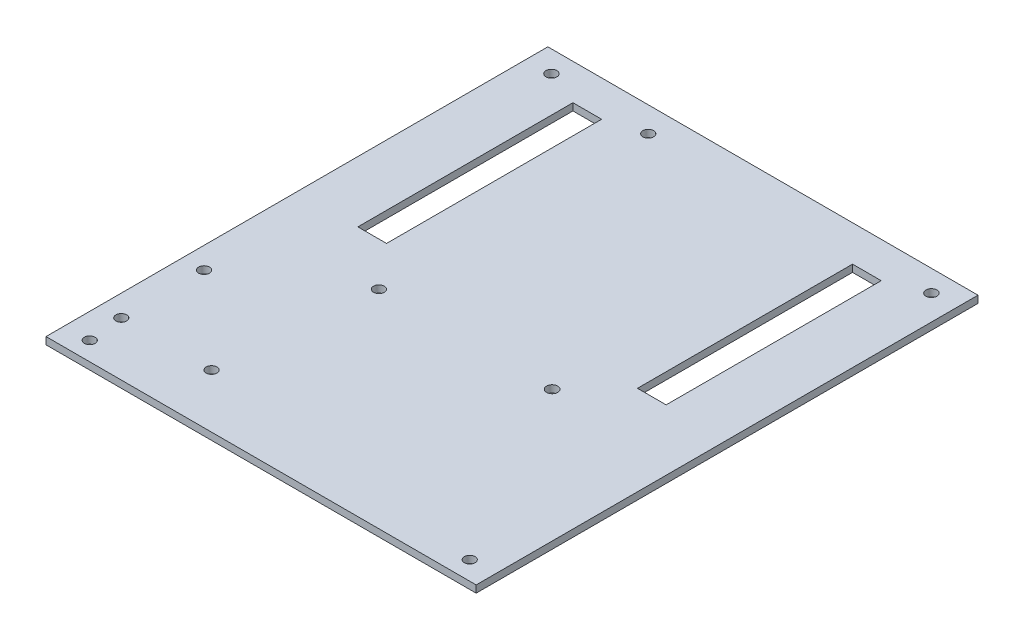
ISO-10303-21;
HEADER;
FILE_DESCRIPTION(('STEP AP214'),'2;1');
FILE_NAME('part.step','',(''),(''),'','','');
FILE_SCHEMA(('AUTOMOTIVE_DESIGN { 1 0 10303 214 1 1 1 1 }'));
ENDSEC;
DATA;
#1=APPLICATION_CONTEXT('core data for automotive mechanical design processes');
#2=APPLICATION_PROTOCOL_DEFINITION('international standard','automotive_design',2000,#1);
#3=PRODUCT_CONTEXT('',#1,'mechanical');
#4=PRODUCT('Part','Part','',(#3));
#5=PRODUCT_RELATED_PRODUCT_CATEGORY('part','',(#4));
#6=PRODUCT_DEFINITION_FORMATION('','',#4);
#7=PRODUCT_DEFINITION_CONTEXT('part definition',#1,'design');
#8=PRODUCT_DEFINITION('design','',#6,#7);
#9=PRODUCT_DEFINITION_SHAPE('','',#8);
#10=(LENGTH_UNIT() NAMED_UNIT(*) SI_UNIT(.MILLI.,.METRE.));
#11=(NAMED_UNIT(*) PLANE_ANGLE_UNIT() SI_UNIT($,.RADIAN.));
#12=(NAMED_UNIT(*) SI_UNIT($,.STERADIAN.) SOLID_ANGLE_UNIT());
#13=UNCERTAINTY_MEASURE_WITH_UNIT(LENGTH_MEASURE(1.E-05),#10,'distance_accuracy_value','');
#14=(GEOMETRIC_REPRESENTATION_CONTEXT(3) GLOBAL_UNCERTAINTY_ASSIGNED_CONTEXT((#13)) GLOBAL_UNIT_ASSIGNED_CONTEXT((#10,
#11,#12)) REPRESENTATION_CONTEXT('',''));
#15=CARTESIAN_POINT('',(0.,0.,0.));
#16=DIRECTION('',(0.,0.,1.));
#17=DIRECTION('',(1.,0.,0.));
#18=AXIS2_PLACEMENT_3D('',#15,#16,#17);
#19=CARTESIAN_POINT('',(-60.,2.,70.));
#20=DIRECTION('',(1.,0.,0.));
#21=DIRECTION('',(0.,0.,-1.));
#22=AXIS2_PLACEMENT_3D('',#19,#20,#21);
#23=PLANE('',#22);
#24=DIRECTION('',(0.,0.,1.));
#25=VECTOR('',#24,1.);
#26=CARTESIAN_POINT('',(-60.,0.,70.));
#27=LINE('',#26,#25);
#28=CARTESIAN_POINT('',(-60.,0.,-70.));
#29=VERTEX_POINT('',#28);
#30=CARTESIAN_POINT('',(-60.,0.,70.));
#31=VERTEX_POINT('',#30);
#32=EDGE_CURVE('E233',#29,#31,#27,.T.);
#33=ORIENTED_EDGE('',*,*,#32,.T.);
#34=DIRECTION('',(0.,-1.,0.));
#35=VECTOR('',#34,1.);
#36=CARTESIAN_POINT('',(-60.,2.,70.));
#37=LINE('',#36,#35);
#38=CARTESIAN_POINT('',(-60.,2.,70.));
#39=VERTEX_POINT('',#38);
#40=EDGE_CURVE('E11',#39,#31,#37,.T.);
#41=ORIENTED_EDGE('',*,*,#40,.F.);
#42=DIRECTION('',(0.,0.,1.));
#43=VECTOR('',#42,1.);
#44=CARTESIAN_POINT('',(-60.,2.,70.));
#45=LINE('',#44,#43);
#46=CARTESIAN_POINT('',(-60.,2.,-70.));
#47=VERTEX_POINT('',#46);
#48=EDGE_CURVE('E236',#47,#39,#45,.T.);
#49=ORIENTED_EDGE('',*,*,#48,.F.);
#50=DIRECTION('',(0.,-1.,0.));
#51=VECTOR('',#50,1.);
#52=CARTESIAN_POINT('',(-60.,2.,-70.));
#53=LINE('',#52,#51);
#54=EDGE_CURVE('E246',#47,#29,#53,.T.);
#55=ORIENTED_EDGE('',*,*,#54,.T.);
#56=EDGE_LOOP('',(#33,#41,#49,#55));
#57=FACE_BOUND('',#56,.T.);
#58=ADVANCED_FACE('F33',(#57),#23,.F.);
#59=CARTESIAN_POINT('',(60.,2.,70.));
#60=DIRECTION('',(0.,0.,-1.));
#61=DIRECTION('',(-1.,0.,0.));
#62=AXIS2_PLACEMENT_3D('',#59,#60,#61);
#63=PLANE('',#62);
#64=DIRECTION('',(1.,0.,0.));
#65=VECTOR('',#64,1.);
#66=CARTESIAN_POINT('',(60.,0.,70.));
#67=LINE('',#66,#65);
#68=CARTESIAN_POINT('',(60.,0.,70.));
#69=VERTEX_POINT('',#68);
#70=EDGE_CURVE('E249',#31,#69,#67,.T.);
#71=ORIENTED_EDGE('',*,*,#70,.T.);
#72=DIRECTION('',(0.,-1.,0.));
#73=VECTOR('',#72,1.);
#74=CARTESIAN_POINT('',(60.,2.,70.));
#75=LINE('',#74,#73);
#76=CARTESIAN_POINT('',(60.,2.,70.));
#77=VERTEX_POINT('',#76);
#78=EDGE_CURVE('E40',#77,#69,#75,.T.);
#79=ORIENTED_EDGE('',*,*,#78,.F.);
#80=DIRECTION('',(1.,0.,0.));
#81=VECTOR('',#80,1.);
#82=CARTESIAN_POINT('',(60.,2.,70.));
#83=LINE('',#82,#81);
#84=EDGE_CURVE('E239',#39,#77,#83,.T.);
#85=ORIENTED_EDGE('',*,*,#84,.F.);
#86=ORIENTED_EDGE('',*,*,#40,.T.);
#87=EDGE_LOOP('',(#71,#79,#85,#86));
#88=FACE_BOUND('',#87,.T.);
#89=ADVANCED_FACE('F278',(#88),#63,.F.);
#90=CARTESIAN_POINT('',(60.,2.,70.));
#91=DIRECTION('',(-1.,0.,0.));
#92=DIRECTION('',(0.,0.,1.));
#93=AXIS2_PLACEMENT_3D('',#90,#91,#92);
#94=PLANE('',#93);
#95=DIRECTION('',(0.,0.,-1.));
#96=VECTOR('',#95,1.);
#97=CARTESIAN_POINT('',(60.,0.,70.));
#98=LINE('',#97,#96);
#99=CARTESIAN_POINT('',(60.,0.,-70.));
#100=VERTEX_POINT('',#99);
#101=EDGE_CURVE('E251',#69,#100,#98,.T.);
#102=ORIENTED_EDGE('',*,*,#101,.T.);
#103=DIRECTION('',(0.,-1.,0.));
#104=VECTOR('',#103,1.);
#105=CARTESIAN_POINT('',(60.,2.,-70.));
#106=LINE('',#105,#104);
#107=CARTESIAN_POINT('',(60.,2.,-70.));
#108=VERTEX_POINT('',#107);
#109=EDGE_CURVE('E256',#108,#100,#106,.T.);
#110=ORIENTED_EDGE('',*,*,#109,.F.);
#111=DIRECTION('',(0.,0.,-1.));
#112=VECTOR('',#111,1.);
#113=CARTESIAN_POINT('',(60.,2.,70.));
#114=LINE('',#113,#112);
#115=EDGE_CURVE('E242',#77,#108,#114,.T.);
#116=ORIENTED_EDGE('',*,*,#115,.F.);
#117=ORIENTED_EDGE('',*,*,#78,.T.);
#118=EDGE_LOOP('',(#102,#110,#116,#117));
#119=FACE_BOUND('',#118,.T.);
#120=ADVANCED_FACE('F263',(#119),#94,.F.);
#121=CARTESIAN_POINT('',(60.,2.,-70.));
#122=DIRECTION('',(0.,0.,1.));
#123=DIRECTION('',(1.,0.,0.));
#124=AXIS2_PLACEMENT_3D('',#121,#122,#123);
#125=PLANE('',#124);
#126=DIRECTION('',(-1.,0.,0.));
#127=VECTOR('',#126,1.);
#128=CARTESIAN_POINT('',(60.,0.,-70.));
#129=LINE('',#128,#127);
#130=EDGE_CURVE('E240',#100,#29,#129,.T.);
#131=ORIENTED_EDGE('',*,*,#130,.T.);
#132=ORIENTED_EDGE('',*,*,#54,.F.);
#133=DIRECTION('',(-1.,0.,0.));
#134=VECTOR('',#133,1.);
#135=CARTESIAN_POINT('',(60.,2.,-70.));
#136=LINE('',#135,#134);
#137=EDGE_CURVE('E244',#108,#47,#136,.T.);
#138=ORIENTED_EDGE('',*,*,#137,.F.);
#139=ORIENTED_EDGE('',*,*,#109,.T.);
#140=EDGE_LOOP('',(#131,#132,#138,#139));
#141=FACE_BOUND('',#140,.T.);
#142=ADVANCED_FACE('F271',(#141),#125,.F.);
#143=CARTESIAN_POINT('',(0.,2.,0.));
#144=DIRECTION('',(0.,1.,0.));
#145=DIRECTION('',(0.,0.,1.));
#146=AXIS2_PLACEMENT_3D('',#143,#144,#145);
#147=PLANE('',#146);
#148=CARTESIAN_POINT('',(-54.,2.,31.9));
#149=DIRECTION('',(0.,1.,0.));
#150=DIRECTION('',(0.,0.,1.));
#151=AXIS2_PLACEMENT_3D('',#148,#149,#150);
#152=CIRCLE('',#151,1.5);
#153=CARTESIAN_POINT('',(-54.,2.,33.4));
#154=VERTEX_POINT('',#153);
#155=EDGE_CURVE('E368',#154,#154,#152,.T.);
#156=ORIENTED_EDGE('',*,*,#155,.F.);
#157=EDGE_LOOP('',(#156));
#158=FACE_BOUND('',#157,.T.);
#159=CARTESIAN_POINT('',(-28.82,2.,55.));
#160=DIRECTION('',(0.,1.,0.));
#161=DIRECTION('',(0.,0.,1.));
#162=AXIS2_PLACEMENT_3D('',#159,#160,#161);
#163=CIRCLE('',#162,1.5);
#164=CARTESIAN_POINT('',(-28.82,2.,56.5));
#165=VERTEX_POINT('',#164);
#166=EDGE_CURVE('E370',#165,#165,#163,.T.);
#167=ORIENTED_EDGE('',*,*,#166,.F.);
#168=EDGE_LOOP('',(#167));
#169=FACE_BOUND('',#168,.T.);
#170=CARTESIAN_POINT('',(-54.,2.,55.));
#171=DIRECTION('',(0.,1.,0.));
#172=DIRECTION('',(0.,0.,1.));
#173=AXIS2_PLACEMENT_3D('',#170,#171,#172);
#174=CIRCLE('',#173,1.5);
#175=CARTESIAN_POINT('',(-54.,2.,56.5));
#176=VERTEX_POINT('',#175);
#177=EDGE_CURVE('E145',#176,#176,#174,.T.);
#178=ORIENTED_EDGE('',*,*,#177,.F.);
#179=EDGE_LOOP('',(#178));
#180=FACE_BOUND('',#179,.T.);
#181=DIRECTION('',(0.,0.,1.));
#182=VECTOR('',#181,1.);
#183=CARTESIAN_POINT('',(35.,2.,-60.));
#184=LINE('',#183,#182);
#185=CARTESIAN_POINT('',(35.,2.,-60.));
#186=VERTEX_POINT('',#185);
#187=CARTESIAN_POINT('',(35.,2.,0.));
#188=VERTEX_POINT('',#187);
#189=EDGE_CURVE('E47',#186,#188,#184,.T.);
#190=ORIENTED_EDGE('',*,*,#189,.F.);
#191=DIRECTION('',(-1.,0.,0.));
#192=VECTOR('',#191,1.);
#193=CARTESIAN_POINT('',(35.,2.,-60.));
#194=LINE('',#193,#192);
#195=CARTESIAN_POINT('',(43.,2.,-60.));
#196=VERTEX_POINT('',#195);
#197=EDGE_CURVE('E139',#196,#186,#194,.T.);
#198=ORIENTED_EDGE('',*,*,#197,.F.);
#199=DIRECTION('',(0.,0.,-1.));
#200=VECTOR('',#199,1.);
#201=CARTESIAN_POINT('',(43.,2.,-60.));
#202=LINE('',#201,#200);
#203=CARTESIAN_POINT('',(43.,2.,0.));
#204=VERTEX_POINT('',#203);
#205=EDGE_CURVE('E142',#204,#196,#202,.T.);
#206=ORIENTED_EDGE('',*,*,#205,.F.);
#207=DIRECTION('',(1.,0.,0.));
#208=VECTOR('',#207,1.);
#209=CARTESIAN_POINT('',(35.,2.,0.));
#210=LINE('',#209,#208);
#211=EDGE_CURVE('E151',#188,#204,#210,.T.);
#212=ORIENTED_EDGE('',*,*,#211,.F.);
#213=EDGE_LOOP('',(#190,#198,#206,#212));
#214=FACE_BOUND('',#213,.T.);
#215=DIRECTION('',(0.,0.,1.));
#216=VECTOR('',#215,1.);
#217=CARTESIAN_POINT('',(-43.,2.,-60.));
#218=LINE('',#217,#216);
#219=CARTESIAN_POINT('',(-43.,2.,-60.));
#220=VERTEX_POINT('',#219);
#221=CARTESIAN_POINT('',(-43.,2.,0.));
#222=VERTEX_POINT('',#221);
#223=EDGE_CURVE('E158',#220,#222,#218,.T.);
#224=ORIENTED_EDGE('',*,*,#223,.F.);
#225=DIRECTION('',(-1.,0.,0.));
#226=VECTOR('',#225,1.);
#227=CARTESIAN_POINT('',(-35.,2.,-60.));
#228=LINE('',#227,#226);
#229=CARTESIAN_POINT('',(-35.,2.,-60.));
#230=VERTEX_POINT('',#229);
#231=EDGE_CURVE('E166',#230,#220,#228,.T.);
#232=ORIENTED_EDGE('',*,*,#231,.F.);
#233=DIRECTION('',(0.,0.,-1.));
#234=VECTOR('',#233,1.);
#235=CARTESIAN_POINT('',(-35.,2.,-60.));
#236=LINE('',#235,#234);
#237=CARTESIAN_POINT('',(-35.,2.,0.));
#238=VERTEX_POINT('',#237);
#239=EDGE_CURVE('E180',#238,#230,#236,.T.);
#240=ORIENTED_EDGE('',*,*,#239,.F.);
#241=DIRECTION('',(1.,0.,0.));
#242=VECTOR('',#241,1.);
#243=CARTESIAN_POINT('',(-35.,2.,0.));
#244=LINE('',#243,#242);
#245=EDGE_CURVE('E177',#222,#238,#244,.T.);
#246=ORIENTED_EDGE('',*,*,#245,.F.);
#247=EDGE_LOOP('',(#224,#232,#240,#246));
#248=FACE_BOUND('',#247,.T.);
#249=CARTESIAN_POINT('',(23.33,2.,12.13));
#250=DIRECTION('',(0.,1.,0.));
#251=DIRECTION('',(0.,0.,1.));
#252=AXIS2_PLACEMENT_3D('',#249,#250,#251);
#253=CIRCLE('',#252,1.55);
#254=CARTESIAN_POINT('',(23.33,2.,13.68));
#255=VERTEX_POINT('',#254);
#256=EDGE_CURVE('E187',#255,#255,#253,.T.);
#257=ORIENTED_EDGE('',*,*,#256,.F.);
#258=EDGE_LOOP('',(#257));
#259=FACE_BOUND('',#258,.T.);
#260=CARTESIAN_POINT('',(-25.,2.,12.13));
#261=DIRECTION('',(0.,1.,0.));
#262=DIRECTION('',(0.,0.,1.));
#263=AXIS2_PLACEMENT_3D('',#260,#261,#262);
#264=CIRCLE('',#263,1.5);
#265=CARTESIAN_POINT('',(-25.,2.,13.63));
#266=VERTEX_POINT('',#265);
#267=EDGE_CURVE('E197',#266,#266,#264,.T.);
#268=ORIENTED_EDGE('',*,*,#267,.F.);
#269=EDGE_LOOP('',(#268));
#270=FACE_BOUND('',#269,.T.);
#271=CARTESIAN_POINT('',(-25.,2.,-63.));
#272=DIRECTION('',(0.,1.,0.));
#273=DIRECTION('',(0.,0.,1.));
#274=AXIS2_PLACEMENT_3D('',#271,#272,#273);
#275=CIRCLE('',#274,1.5);
#276=CARTESIAN_POINT('',(-25.,2.,-61.5));
#277=VERTEX_POINT('',#276);
#278=EDGE_CURVE('E203',#277,#277,#275,.T.);
#279=ORIENTED_EDGE('',*,*,#278,.F.);
#280=EDGE_LOOP('',(#279));
#281=FACE_BOUND('',#280,.T.);
#282=CARTESIAN_POINT('',(53.,2.,64.8));
#283=DIRECTION('',(0.,1.,0.));
#284=DIRECTION('',(0.,0.,-1.));
#285=AXIS2_PLACEMENT_3D('',#282,#283,#284);
#286=CIRCLE('',#285,1.5);
#287=CARTESIAN_POINT('',(53.,2.,63.3));
#288=VERTEX_POINT('',#287);
#289=EDGE_CURVE('E209',#288,#288,#286,.T.);
#290=ORIENTED_EDGE('',*,*,#289,.F.);
#291=EDGE_LOOP('',(#290));
#292=FACE_BOUND('',#291,.T.);
#293=CARTESIAN_POINT('',(53.,2.,-64.));
#294=DIRECTION('',(0.,1.,0.));
#295=DIRECTION('',(0.,0.,-1.));
#296=AXIS2_PLACEMENT_3D('',#293,#294,#295);
#297=CIRCLE('',#296,1.525);
#298=CARTESIAN_POINT('',(53.,2.,-65.525));
#299=VERTEX_POINT('',#298);
#300=EDGE_CURVE('E215',#299,#299,#297,.T.);
#301=ORIENTED_EDGE('',*,*,#300,.F.);
#302=EDGE_LOOP('',(#301));
#303=FACE_BOUND('',#302,.T.);
#304=CARTESIAN_POINT('',(-53.,2.,64.8));
#305=DIRECTION('',(0.,1.,0.));
#306=DIRECTION('',(0.,0.,1.));
#307=AXIS2_PLACEMENT_3D('',#304,#305,#306);
#308=CIRCLE('',#307,1.5);
#309=CARTESIAN_POINT('',(-53.,2.,66.3));
#310=VERTEX_POINT('',#309);
#311=EDGE_CURVE('E221',#310,#310,#308,.T.);
#312=ORIENTED_EDGE('',*,*,#311,.F.);
#313=EDGE_LOOP('',(#312));
#314=FACE_BOUND('',#313,.T.);
#315=CARTESIAN_POINT('',(-53.,2.,-64.));
#316=DIRECTION('',(0.,1.,0.));
#317=DIRECTION('',(0.,0.,1.));
#318=AXIS2_PLACEMENT_3D('',#315,#316,#317);
#319=CIRCLE('',#318,1.525);
#320=CARTESIAN_POINT('',(-53.,2.,-62.475));
#321=VERTEX_POINT('',#320);
#322=EDGE_CURVE('E227',#321,#321,#319,.T.);
#323=ORIENTED_EDGE('',*,*,#322,.F.);
#324=EDGE_LOOP('',(#323));
#325=FACE_BOUND('',#324,.T.);
#326=ORIENTED_EDGE('',*,*,#48,.T.);
#327=ORIENTED_EDGE('',*,*,#84,.T.);
#328=ORIENTED_EDGE('',*,*,#115,.T.);
#329=ORIENTED_EDGE('',*,*,#137,.T.);
#330=EDGE_LOOP('',(#326,#327,#328,#329));
#331=FACE_BOUND('',#330,.T.);
#332=ADVANCED_FACE('F277',(#158,#169,#180,#214,#248,#259,#270,#281,#292,#303,#314,#325,#331),
#147,.T.);
#333=CARTESIAN_POINT('',(0.,0.,0.));
#334=DIRECTION('',(0.,1.,0.));
#335=DIRECTION('',(0.,0.,1.));
#336=AXIS2_PLACEMENT_3D('',#333,#334,#335);
#337=PLANE('',#336);
#338=CARTESIAN_POINT('',(-54.,0.,31.9));
#339=DIRECTION('',(0.,1.,0.));
#340=DIRECTION('',(0.,0.,1.));
#341=AXIS2_PLACEMENT_3D('',#338,#339,#340);
#342=CIRCLE('',#341,1.5);
#343=CARTESIAN_POINT('',(-54.,0.,33.4));
#344=VERTEX_POINT('',#343);
#345=EDGE_CURVE('E365',#344,#344,#342,.T.);
#346=ORIENTED_EDGE('',*,*,#345,.T.);
#347=EDGE_LOOP('',(#346));
#348=FACE_BOUND('',#347,.T.);
#349=CARTESIAN_POINT('',(-28.82,0.,55.));
#350=DIRECTION('',(0.,1.,0.));
#351=DIRECTION('',(0.,0.,1.));
#352=AXIS2_PLACEMENT_3D('',#349,#350,#351);
#353=CIRCLE('',#352,1.5);
#354=CARTESIAN_POINT('',(-28.82,0.,56.5));
#355=VERTEX_POINT('',#354);
#356=EDGE_CURVE('E373',#355,#355,#353,.T.);
#357=ORIENTED_EDGE('',*,*,#356,.T.);
#358=EDGE_LOOP('',(#357));
#359=FACE_BOUND('',#358,.T.);
#360=CARTESIAN_POINT('',(-54.,0.,55.));
#361=DIRECTION('',(0.,1.,0.));
#362=DIRECTION('',(0.,0.,1.));
#363=AXIS2_PLACEMENT_3D('',#360,#361,#362);
#364=CIRCLE('',#363,1.5);
#365=CARTESIAN_POINT('',(-54.,0.,56.5));
#366=VERTEX_POINT('',#365);
#367=EDGE_CURVE('E152',#366,#366,#364,.T.);
#368=ORIENTED_EDGE('',*,*,#367,.T.);
#369=EDGE_LOOP('',(#368));
#370=FACE_BOUND('',#369,.T.);
#371=DIRECTION('',(-1.,0.,0.));
#372=VECTOR('',#371,1.);
#373=CARTESIAN_POINT('',(35.,0.,-60.));
#374=LINE('',#373,#372);
#375=CARTESIAN_POINT('',(43.,0.,-60.));
#376=VERTEX_POINT('',#375);
#377=CARTESIAN_POINT('',(35.,0.,-60.));
#378=VERTEX_POINT('',#377);
#379=EDGE_CURVE('E129',#376,#378,#374,.T.);
#380=ORIENTED_EDGE('',*,*,#379,.T.);
#381=DIRECTION('',(0.,0.,1.));
#382=VECTOR('',#381,1.);
#383=CARTESIAN_POINT('',(35.,0.,-60.));
#384=LINE('',#383,#382);
#385=CARTESIAN_POINT('',(35.,0.,0.));
#386=VERTEX_POINT('',#385);
#387=EDGE_CURVE('E123',#378,#386,#384,.T.);
#388=ORIENTED_EDGE('',*,*,#387,.T.);
#389=DIRECTION('',(1.,0.,0.));
#390=VECTOR('',#389,1.);
#391=CARTESIAN_POINT('',(35.,0.,0.));
#392=LINE('',#391,#390);
#393=CARTESIAN_POINT('',(43.,0.,0.));
#394=VERTEX_POINT('',#393);
#395=EDGE_CURVE('E132',#386,#394,#392,.T.);
#396=ORIENTED_EDGE('',*,*,#395,.T.);
#397=DIRECTION('',(0.,0.,-1.));
#398=VECTOR('',#397,1.);
#399=CARTESIAN_POINT('',(43.,0.,-60.));
#400=LINE('',#399,#398);
#401=EDGE_CURVE('E55',#394,#376,#400,.T.);
#402=ORIENTED_EDGE('',*,*,#401,.T.);
#403=EDGE_LOOP('',(#380,#388,#396,#402));
#404=FACE_BOUND('',#403,.T.);
#405=DIRECTION('',(-1.,0.,0.));
#406=VECTOR('',#405,1.);
#407=CARTESIAN_POINT('',(-35.,0.,-60.));
#408=LINE('',#407,#406);
#409=CARTESIAN_POINT('',(-35.,0.,-60.));
#410=VERTEX_POINT('',#409);
#411=CARTESIAN_POINT('',(-43.,0.,-60.));
#412=VERTEX_POINT('',#411);
#413=EDGE_CURVE('E172',#410,#412,#408,.T.);
#414=ORIENTED_EDGE('',*,*,#413,.T.);
#415=DIRECTION('',(0.,0.,1.));
#416=VECTOR('',#415,1.);
#417=CARTESIAN_POINT('',(-43.,0.,-60.));
#418=LINE('',#417,#416);
#419=CARTESIAN_POINT('',(-43.,0.,0.));
#420=VERTEX_POINT('',#419);
#421=EDGE_CURVE('E162',#412,#420,#418,.T.);
#422=ORIENTED_EDGE('',*,*,#421,.T.);
#423=DIRECTION('',(1.,0.,0.));
#424=VECTOR('',#423,1.);
#425=CARTESIAN_POINT('',(-35.,0.,0.));
#426=LINE('',#425,#424);
#427=CARTESIAN_POINT('',(-35.,0.,0.));
#428=VERTEX_POINT('',#427);
#429=EDGE_CURVE('E165',#420,#428,#426,.T.);
#430=ORIENTED_EDGE('',*,*,#429,.T.);
#431=DIRECTION('',(0.,0.,-1.));
#432=VECTOR('',#431,1.);
#433=CARTESIAN_POINT('',(-35.,0.,-60.));
#434=LINE('',#433,#432);
#435=EDGE_CURVE('E169',#428,#410,#434,.T.);
#436=ORIENTED_EDGE('',*,*,#435,.T.);
#437=EDGE_LOOP('',(#414,#422,#430,#436));
#438=FACE_BOUND('',#437,.T.);
#439=CARTESIAN_POINT('',(23.33,0.,12.13));
#440=DIRECTION('',(0.,1.,0.));
#441=DIRECTION('',(0.,0.,1.));
#442=AXIS2_PLACEMENT_3D('',#439,#440,#441);
#443=CIRCLE('',#442,1.55);
#444=CARTESIAN_POINT('',(23.33,0.,13.68));
#445=VERTEX_POINT('',#444);
#446=EDGE_CURVE('E194',#445,#445,#443,.T.);
#447=ORIENTED_EDGE('',*,*,#446,.T.);
#448=EDGE_LOOP('',(#447));
#449=FACE_BOUND('',#448,.T.);
#450=CARTESIAN_POINT('',(-25.,0.,12.13));
#451=DIRECTION('',(0.,1.,0.));
#452=DIRECTION('',(0.,0.,1.));
#453=AXIS2_PLACEMENT_3D('',#450,#451,#452);
#454=CIRCLE('',#453,1.5);
#455=CARTESIAN_POINT('',(-25.,0.,13.63));
#456=VERTEX_POINT('',#455);
#457=EDGE_CURVE('E200',#456,#456,#454,.T.);
#458=ORIENTED_EDGE('',*,*,#457,.T.);
#459=EDGE_LOOP('',(#458));
#460=FACE_BOUND('',#459,.T.);
#461=CARTESIAN_POINT('',(-25.,0.,-63.));
#462=DIRECTION('',(0.,1.,0.));
#463=DIRECTION('',(0.,0.,1.));
#464=AXIS2_PLACEMENT_3D('',#461,#462,#463);
#465=CIRCLE('',#464,1.5);
#466=CARTESIAN_POINT('',(-25.,0.,-61.5));
#467=VERTEX_POINT('',#466);
#468=EDGE_CURVE('E206',#467,#467,#465,.T.);
#469=ORIENTED_EDGE('',*,*,#468,.T.);
#470=EDGE_LOOP('',(#469));
#471=FACE_BOUND('',#470,.T.);
#472=CARTESIAN_POINT('',(53.,0.,64.8));
#473=DIRECTION('',(0.,1.,0.));
#474=DIRECTION('',(0.,0.,-1.));
#475=AXIS2_PLACEMENT_3D('',#472,#473,#474);
#476=CIRCLE('',#475,1.5);
#477=CARTESIAN_POINT('',(53.,0.,63.3));
#478=VERTEX_POINT('',#477);
#479=EDGE_CURVE('E212',#478,#478,#476,.T.);
#480=ORIENTED_EDGE('',*,*,#479,.T.);
#481=EDGE_LOOP('',(#480));
#482=FACE_BOUND('',#481,.T.);
#483=CARTESIAN_POINT('',(53.,0.,-64.));
#484=DIRECTION('',(0.,1.,0.));
#485=DIRECTION('',(0.,0.,-1.));
#486=AXIS2_PLACEMENT_3D('',#483,#484,#485);
#487=CIRCLE('',#486,1.525);
#488=CARTESIAN_POINT('',(53.,0.,-65.525));
#489=VERTEX_POINT('',#488);
#490=EDGE_CURVE('E218',#489,#489,#487,.T.);
#491=ORIENTED_EDGE('',*,*,#490,.T.);
#492=EDGE_LOOP('',(#491));
#493=FACE_BOUND('',#492,.T.);
#494=CARTESIAN_POINT('',(-53.,0.,64.8));
#495=DIRECTION('',(0.,1.,0.));
#496=DIRECTION('',(0.,0.,1.));
#497=AXIS2_PLACEMENT_3D('',#494,#495,#496);
#498=CIRCLE('',#497,1.5);
#499=CARTESIAN_POINT('',(-53.,0.,66.3));
#500=VERTEX_POINT('',#499);
#501=EDGE_CURVE('E224',#500,#500,#498,.T.);
#502=ORIENTED_EDGE('',*,*,#501,.T.);
#503=EDGE_LOOP('',(#502));
#504=FACE_BOUND('',#503,.T.);
#505=CARTESIAN_POINT('',(-53.,0.,-64.));
#506=DIRECTION('',(0.,1.,0.));
#507=DIRECTION('',(0.,0.,1.));
#508=AXIS2_PLACEMENT_3D('',#505,#506,#507);
#509=CIRCLE('',#508,1.525);
#510=CARTESIAN_POINT('',(-53.,0.,-62.475));
#511=VERTEX_POINT('',#510);
#512=EDGE_CURVE('E230',#511,#511,#509,.T.);
#513=ORIENTED_EDGE('',*,*,#512,.T.);
#514=EDGE_LOOP('',(#513));
#515=FACE_BOUND('',#514,.T.);
#516=ORIENTED_EDGE('',*,*,#32,.F.);
#517=ORIENTED_EDGE('',*,*,#130,.F.);
#518=ORIENTED_EDGE('',*,*,#101,.F.);
#519=ORIENTED_EDGE('',*,*,#70,.F.);
#520=EDGE_LOOP('',(#516,#517,#518,#519));
#521=FACE_BOUND('',#520,.T.);
#522=ADVANCED_FACE('F136',(#348,#359,#370,#404,#438,#449,#460,#471,#482,#493,#504,#515,#521),
#337,.F.);
#523=CARTESIAN_POINT('',(-53.,0.,-64.));
#524=DIRECTION('',(0.,1.,0.));
#525=DIRECTION('',(0.,0.,1.));
#526=AXIS2_PLACEMENT_3D('',#523,#524,#525);
#527=CYLINDRICAL_SURFACE('',#526,1.525);
#528=ORIENTED_EDGE('',*,*,#512,.F.);
#529=EDGE_LOOP('',(#528));
#530=FACE_BOUND('',#529,.T.);
#531=ORIENTED_EDGE('',*,*,#322,.T.);
#532=EDGE_LOOP('',(#531));
#533=FACE_BOUND('',#532,.T.);
#534=ADVANCED_FACE('F290',(#530,#533),#527,.F.);
#535=CARTESIAN_POINT('',(-53.,0.,64.8));
#536=DIRECTION('',(0.,1.,0.));
#537=DIRECTION('',(0.,0.,1.));
#538=AXIS2_PLACEMENT_3D('',#535,#536,#537);
#539=CYLINDRICAL_SURFACE('',#538,1.5);
#540=ORIENTED_EDGE('',*,*,#501,.F.);
#541=EDGE_LOOP('',(#540));
#542=FACE_BOUND('',#541,.T.);
#543=ORIENTED_EDGE('',*,*,#311,.T.);
#544=EDGE_LOOP('',(#543));
#545=FACE_BOUND('',#544,.T.);
#546=ADVANCED_FACE('F297',(#542,#545),#539,.F.);
#547=CARTESIAN_POINT('',(53.,0.,-64.));
#548=DIRECTION('',(0.,1.,0.));
#549=DIRECTION('',(0.,0.,1.));
#550=AXIS2_PLACEMENT_3D('',#547,#548,#549);
#551=CYLINDRICAL_SURFACE('',#550,1.525);
#552=ORIENTED_EDGE('',*,*,#490,.F.);
#553=EDGE_LOOP('',(#552));
#554=FACE_BOUND('',#553,.T.);
#555=ORIENTED_EDGE('',*,*,#300,.T.);
#556=EDGE_LOOP('',(#555));
#557=FACE_BOUND('',#556,.T.);
#558=ADVANCED_FACE('F301',(#554,#557),#551,.F.);
#559=CARTESIAN_POINT('',(53.,0.,64.8));
#560=DIRECTION('',(0.,1.,0.));
#561=DIRECTION('',(0.,0.,1.));
#562=AXIS2_PLACEMENT_3D('',#559,#560,#561);
#563=CYLINDRICAL_SURFACE('',#562,1.5);
#564=ORIENTED_EDGE('',*,*,#479,.F.);
#565=EDGE_LOOP('',(#564));
#566=FACE_BOUND('',#565,.T.);
#567=ORIENTED_EDGE('',*,*,#289,.T.);
#568=EDGE_LOOP('',(#567));
#569=FACE_BOUND('',#568,.T.);
#570=ADVANCED_FACE('F305',(#566,#569),#563,.F.);
#571=CARTESIAN_POINT('',(-25.,0.,-63.));
#572=DIRECTION('',(0.,1.,0.));
#573=DIRECTION('',(0.,0.,1.));
#574=AXIS2_PLACEMENT_3D('',#571,#572,#573);
#575=CYLINDRICAL_SURFACE('',#574,1.5);
#576=ORIENTED_EDGE('',*,*,#468,.F.);
#577=EDGE_LOOP('',(#576));
#578=FACE_BOUND('',#577,.T.);
#579=ORIENTED_EDGE('',*,*,#278,.T.);
#580=EDGE_LOOP('',(#579));
#581=FACE_BOUND('',#580,.T.);
#582=ADVANCED_FACE('F309',(#578,#581),#575,.F.);
#583=CARTESIAN_POINT('',(-25.,0.,12.13));
#584=DIRECTION('',(0.,1.,0.));
#585=DIRECTION('',(0.,0.,1.));
#586=AXIS2_PLACEMENT_3D('',#583,#584,#585);
#587=CYLINDRICAL_SURFACE('',#586,1.5);
#588=ORIENTED_EDGE('',*,*,#457,.F.);
#589=EDGE_LOOP('',(#588));
#590=FACE_BOUND('',#589,.T.);
#591=ORIENTED_EDGE('',*,*,#267,.T.);
#592=EDGE_LOOP('',(#591));
#593=FACE_BOUND('',#592,.T.);
#594=ADVANCED_FACE('F313',(#590,#593),#587,.F.);
#595=CARTESIAN_POINT('',(23.33,0.,12.13));
#596=DIRECTION('',(0.,1.,0.));
#597=DIRECTION('',(0.,0.,1.));
#598=AXIS2_PLACEMENT_3D('',#595,#596,#597);
#599=CYLINDRICAL_SURFACE('',#598,1.55);
#600=ORIENTED_EDGE('',*,*,#446,.F.);
#601=EDGE_LOOP('',(#600));
#602=FACE_BOUND('',#601,.T.);
#603=ORIENTED_EDGE('',*,*,#256,.T.);
#604=EDGE_LOOP('',(#603));
#605=FACE_BOUND('',#604,.T.);
#606=ADVANCED_FACE('F317',(#602,#605),#599,.F.);
#607=CARTESIAN_POINT('',(-43.,0.,-60.));
#608=DIRECTION('',(-1.,0.,0.));
#609=DIRECTION('',(0.,0.,1.));
#610=AXIS2_PLACEMENT_3D('',#607,#608,#609);
#611=PLANE('',#610);
#612=ORIENTED_EDGE('',*,*,#223,.T.);
#613=DIRECTION('',(0.,1.,0.));
#614=VECTOR('',#613,1.);
#615=CARTESIAN_POINT('',(-43.,0.,0.));
#616=LINE('',#615,#614);
#617=EDGE_CURVE('E175',#420,#222,#616,.T.);
#618=ORIENTED_EDGE('',*,*,#617,.F.);
#619=ORIENTED_EDGE('',*,*,#421,.F.);
#620=DIRECTION('',(0.,1.,0.));
#621=VECTOR('',#620,1.);
#622=CARTESIAN_POINT('',(-43.,0.,-60.));
#623=LINE('',#622,#621);
#624=EDGE_CURVE('E185',#412,#220,#623,.T.);
#625=ORIENTED_EDGE('',*,*,#624,.T.);
#626=EDGE_LOOP('',(#612,#618,#619,#625));
#627=FACE_BOUND('',#626,.T.);
#628=ADVANCED_FACE('F321',(#627),#611,.F.);
#629=CARTESIAN_POINT('',(-35.,0.,-60.));
#630=DIRECTION('',(0.,0.,-1.));
#631=DIRECTION('',(-1.,0.,0.));
#632=AXIS2_PLACEMENT_3D('',#629,#630,#631);
#633=PLANE('',#632);
#634=ORIENTED_EDGE('',*,*,#231,.T.);
#635=ORIENTED_EDGE('',*,*,#624,.F.);
#636=ORIENTED_EDGE('',*,*,#413,.F.);
#637=DIRECTION('',(0.,1.,0.));
#638=VECTOR('',#637,1.);
#639=CARTESIAN_POINT('',(-35.,0.,-60.));
#640=LINE('',#639,#638);
#641=EDGE_CURVE('E188',#410,#230,#640,.T.);
#642=ORIENTED_EDGE('',*,*,#641,.T.);
#643=EDGE_LOOP('',(#634,#635,#636,#642));
#644=FACE_BOUND('',#643,.T.);
#645=ADVANCED_FACE('F325',(#644),#633,.F.);
#646=CARTESIAN_POINT('',(-35.,0.,-60.));
#647=DIRECTION('',(1.,0.,0.));
#648=DIRECTION('',(0.,0.,-1.));
#649=AXIS2_PLACEMENT_3D('',#646,#647,#648);
#650=PLANE('',#649);
#651=ORIENTED_EDGE('',*,*,#239,.T.);
#652=ORIENTED_EDGE('',*,*,#641,.F.);
#653=ORIENTED_EDGE('',*,*,#435,.F.);
#654=DIRECTION('',(0.,1.,0.));
#655=VECTOR('',#654,1.);
#656=CARTESIAN_POINT('',(-35.,0.,0.));
#657=LINE('',#656,#655);
#658=EDGE_CURVE('E190',#428,#238,#657,.T.);
#659=ORIENTED_EDGE('',*,*,#658,.T.);
#660=EDGE_LOOP('',(#651,#652,#653,#659));
#661=FACE_BOUND('',#660,.T.);
#662=ADVANCED_FACE('F330',(#661),#650,.F.);
#663=CARTESIAN_POINT('',(-35.,0.,0.));
#664=DIRECTION('',(0.,0.,1.));
#665=DIRECTION('',(1.,0.,0.));
#666=AXIS2_PLACEMENT_3D('',#663,#664,#665);
#667=PLANE('',#666);
#668=ORIENTED_EDGE('',*,*,#245,.T.);
#669=ORIENTED_EDGE('',*,*,#658,.F.);
#670=ORIENTED_EDGE('',*,*,#429,.F.);
#671=ORIENTED_EDGE('',*,*,#617,.T.);
#672=EDGE_LOOP('',(#668,#669,#670,#671));
#673=FACE_BOUND('',#672,.T.);
#674=ADVANCED_FACE('F327',(#673),#667,.F.);
#675=CARTESIAN_POINT('',(35.,0.,-60.));
#676=DIRECTION('',(-1.,0.,0.));
#677=DIRECTION('',(0.,0.,1.));
#678=AXIS2_PLACEMENT_3D('',#675,#676,#677);
#679=PLANE('',#678);
#680=ORIENTED_EDGE('',*,*,#189,.T.);
#681=DIRECTION('',(0.,1.,0.));
#682=VECTOR('',#681,1.);
#683=CARTESIAN_POINT('',(35.,0.,0.));
#684=LINE('',#683,#682);
#685=EDGE_CURVE('E119',#386,#188,#684,.T.);
#686=ORIENTED_EDGE('',*,*,#685,.F.);
#687=ORIENTED_EDGE('',*,*,#387,.F.);
#688=DIRECTION('',(0.,1.,0.));
#689=VECTOR('',#688,1.);
#690=CARTESIAN_POINT('',(35.,0.,-60.));
#691=LINE('',#690,#689);
#692=EDGE_CURVE('E156',#378,#186,#691,.T.);
#693=ORIENTED_EDGE('',*,*,#692,.T.);
#694=EDGE_LOOP('',(#680,#686,#687,#693));
#695=FACE_BOUND('',#694,.T.);
#696=ADVANCED_FACE('F121',(#695),#679,.F.);
#697=CARTESIAN_POINT('',(35.,0.,-60.));
#698=DIRECTION('',(0.,0.,-1.));
#699=DIRECTION('',(-1.,0.,0.));
#700=AXIS2_PLACEMENT_3D('',#697,#698,#699);
#701=PLANE('',#700);
#702=ORIENTED_EDGE('',*,*,#197,.T.);
#703=ORIENTED_EDGE('',*,*,#692,.F.);
#704=ORIENTED_EDGE('',*,*,#379,.F.);
#705=DIRECTION('',(0.,1.,0.));
#706=VECTOR('',#705,1.);
#707=CARTESIAN_POINT('',(43.,0.,-60.));
#708=LINE('',#707,#706);
#709=EDGE_CURVE('E159',#376,#196,#708,.T.);
#710=ORIENTED_EDGE('',*,*,#709,.T.);
#711=EDGE_LOOP('',(#702,#703,#704,#710));
#712=FACE_BOUND('',#711,.T.);
#713=ADVANCED_FACE('F340',(#712),#701,.F.);
#714=CARTESIAN_POINT('',(43.,0.,-60.));
#715=DIRECTION('',(1.,0.,0.));
#716=DIRECTION('',(0.,0.,-1.));
#717=AXIS2_PLACEMENT_3D('',#714,#715,#716);
#718=PLANE('',#717);
#719=ORIENTED_EDGE('',*,*,#205,.T.);
#720=ORIENTED_EDGE('',*,*,#709,.F.);
#721=ORIENTED_EDGE('',*,*,#401,.F.);
#722=DIRECTION('',(0.,1.,0.));
#723=VECTOR('',#722,1.);
#724=CARTESIAN_POINT('',(43.,0.,0.));
#725=LINE('',#724,#723);
#726=EDGE_CURVE('E128',#394,#204,#725,.T.);
#727=ORIENTED_EDGE('',*,*,#726,.T.);
#728=EDGE_LOOP('',(#719,#720,#721,#727));
#729=FACE_BOUND('',#728,.T.);
#730=ADVANCED_FACE('F344',(#729),#718,.F.);
#731=CARTESIAN_POINT('',(35.,0.,0.));
#732=DIRECTION('',(0.,0.,1.));
#733=DIRECTION('',(1.,0.,0.));
#734=AXIS2_PLACEMENT_3D('',#731,#732,#733);
#735=PLANE('',#734);
#736=ORIENTED_EDGE('',*,*,#211,.T.);
#737=ORIENTED_EDGE('',*,*,#726,.F.);
#738=ORIENTED_EDGE('',*,*,#395,.F.);
#739=ORIENTED_EDGE('',*,*,#685,.T.);
#740=EDGE_LOOP('',(#736,#737,#738,#739));
#741=FACE_BOUND('',#740,.T.);
#742=ADVANCED_FACE('F133',(#741),#735,.F.);
#743=CARTESIAN_POINT('',(-54.,0.,55.));
#744=DIRECTION('',(0.,1.,0.));
#745=DIRECTION('',(0.,0.,1.));
#746=AXIS2_PLACEMENT_3D('',#743,#744,#745);
#747=CYLINDRICAL_SURFACE('',#746,1.5);
#748=ORIENTED_EDGE('',*,*,#367,.F.);
#749=EDGE_LOOP('',(#748));
#750=FACE_BOUND('',#749,.T.);
#751=ORIENTED_EDGE('',*,*,#177,.T.);
#752=EDGE_LOOP('',(#751));
#753=FACE_BOUND('',#752,.T.);
#754=ADVANCED_FACE('F343',(#750,#753),#747,.F.);
#755=CARTESIAN_POINT('',(-28.82,0.,55.));
#756=DIRECTION('',(0.,1.,0.));
#757=DIRECTION('',(0.,0.,1.));
#758=AXIS2_PLACEMENT_3D('',#755,#756,#757);
#759=CYLINDRICAL_SURFACE('',#758,1.5);
#760=ORIENTED_EDGE('',*,*,#356,.F.);
#761=EDGE_LOOP('',(#760));
#762=FACE_BOUND('',#761,.T.);
#763=ORIENTED_EDGE('',*,*,#166,.T.);
#764=EDGE_LOOP('',(#763));
#765=FACE_BOUND('',#764,.T.);
#766=ADVANCED_FACE('F352',(#762,#765),#759,.F.);
#767=CARTESIAN_POINT('',(-54.,0.,31.9));
#768=DIRECTION('',(0.,1.,0.));
#769=DIRECTION('',(0.,0.,1.));
#770=AXIS2_PLACEMENT_3D('',#767,#768,#769);
#771=CYLINDRICAL_SURFACE('',#770,1.5);
#772=ORIENTED_EDGE('',*,*,#345,.F.);
#773=EDGE_LOOP('',(#772));
#774=FACE_BOUND('',#773,.T.);
#775=ORIENTED_EDGE('',*,*,#155,.T.);
#776=EDGE_LOOP('',(#775));
#777=FACE_BOUND('',#776,.T.);
#778=ADVANCED_FACE('F356',(#774,#777),#771,.F.);
#779=CLOSED_SHELL('',(#58,#89,#120,#142,#332,#522,#534,#546,#558,#570,#582,#594,#606,#628,#645,
#662,#674,#696,#713,#730,#742,#754,#766,#778));
#780=MANIFOLD_SOLID_BREP('B2',#779);
#781=ADVANCED_BREP_SHAPE_REPRESENTATION('',(#18,#780),#14);
#782=SHAPE_DEFINITION_REPRESENTATION(#9,#781);
ENDSEC;
END-ISO-10303-21;
